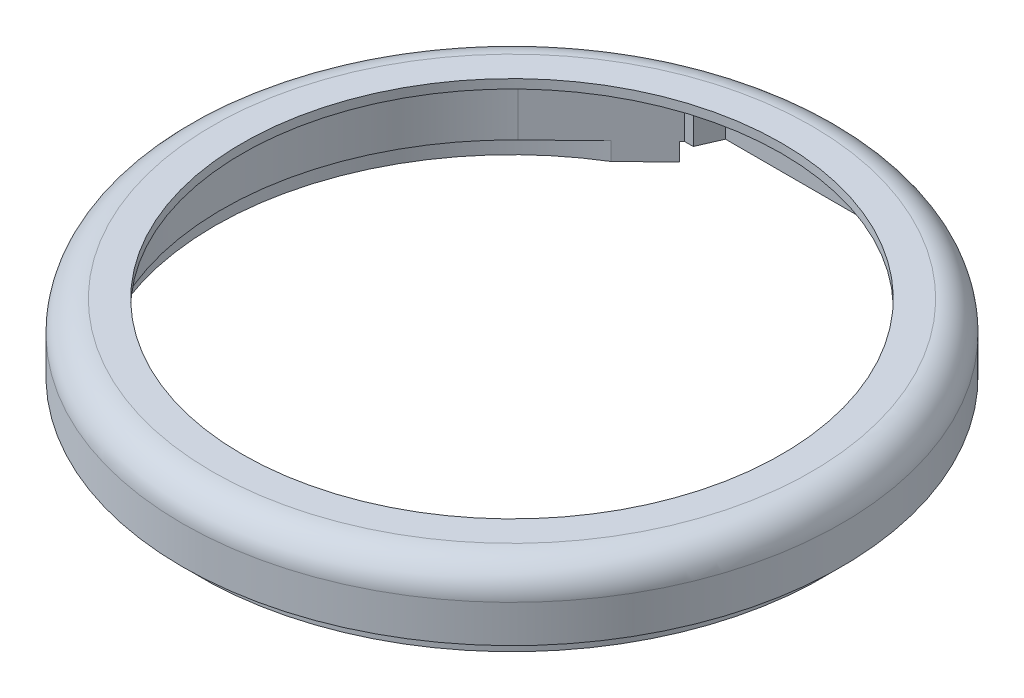
ISO-10303-21;
HEADER;
FILE_DESCRIPTION(('STEP AP214'),'2;1');
FILE_NAME('part.step','',(''),(''),'','','');
FILE_SCHEMA(('AUTOMOTIVE_DESIGN { 1 0 10303 214 1 1 1 1 }'));
ENDSEC;
DATA;
#1=APPLICATION_CONTEXT('core data for automotive mechanical design processes');
#2=APPLICATION_PROTOCOL_DEFINITION('international standard','automotive_design',2000,#1);
#3=PRODUCT_CONTEXT('',#1,'mechanical');
#4=PRODUCT('Part','Part','',(#3));
#5=PRODUCT_RELATED_PRODUCT_CATEGORY('part','',(#4));
#6=PRODUCT_DEFINITION_FORMATION('','',#4);
#7=PRODUCT_DEFINITION_CONTEXT('part definition',#1,'design');
#8=PRODUCT_DEFINITION('design','',#6,#7);
#9=PRODUCT_DEFINITION_SHAPE('','',#8);
#10=(LENGTH_UNIT() NAMED_UNIT(*) SI_UNIT(.MILLI.,.METRE.));
#11=(NAMED_UNIT(*) PLANE_ANGLE_UNIT() SI_UNIT($,.RADIAN.));
#12=(NAMED_UNIT(*) SI_UNIT($,.STERADIAN.) SOLID_ANGLE_UNIT());
#13=UNCERTAINTY_MEASURE_WITH_UNIT(LENGTH_MEASURE(1.E-05),#10,'distance_accuracy_value','');
#14=(GEOMETRIC_REPRESENTATION_CONTEXT(3) GLOBAL_UNCERTAINTY_ASSIGNED_CONTEXT((#13)) GLOBAL_UNIT_ASSIGNED_CONTEXT((#10,
#11,#12)) REPRESENTATION_CONTEXT('',''));
#15=CARTESIAN_POINT('',(0.,0.,0.));
#16=DIRECTION('',(0.,0.,1.));
#17=DIRECTION('',(1.,0.,0.));
#18=AXIS2_PLACEMENT_3D('',#15,#16,#17);
#19=CARTESIAN_POINT('',(-7.85,59.2300648638388,-19.35));
#20=DIRECTION('',(0.,0.,-1.));
#21=DIRECTION('',(-1.,0.,0.));
#22=AXIS2_PLACEMENT_3D('',#19,#20,#21);
#23=PLANE('',#22);
#24=DIRECTION('',(-1.,0.,0.));
#25=VECTOR('',#24,1.);
#26=CARTESIAN_POINT('',(0.,0.,-19.35));
#27=LINE('',#26,#25);
#28=CARTESIAN_POINT('',(-7.25,0.,-19.35));
#29=VERTEX_POINT('',#28);
#30=CARTESIAN_POINT('',(-7.85,0.,-19.35));
#31=VERTEX_POINT('',#30);
#32=EDGE_CURVE('E137',#29,#31,#27,.T.);
#33=ORIENTED_EDGE('',*,*,#32,.F.);
#34=DIRECTION('',(0.,-1.,0.));
#35=VECTOR('',#34,1.);
#36=CARTESIAN_POINT('',(-7.25,19.0773797371133,-19.35));
#37=LINE('',#36,#35);
#38=CARTESIAN_POINT('',(-7.25,3.1,-19.35));
#39=VERTEX_POINT('',#38);
#40=EDGE_CURVE('E141',#39,#29,#37,.T.);
#41=ORIENTED_EDGE('',*,*,#40,.F.);
#42=DIRECTION('',(-1.,0.,0.));
#43=VECTOR('',#42,1.);
#44=CARTESIAN_POINT('',(-7.25,3.1,-19.35));
#45=LINE('',#44,#43);
#46=CARTESIAN_POINT('',(7.25,3.1,-19.35));
#47=VERTEX_POINT('',#46);
#48=EDGE_CURVE('E162',#47,#39,#45,.T.);
#49=ORIENTED_EDGE('',*,*,#48,.F.);
#50=DIRECTION('',(0.,-1.,0.));
#51=VECTOR('',#50,1.);
#52=CARTESIAN_POINT('',(7.25,19.0773797371133,-19.35));
#53=LINE('',#52,#51);
#54=CARTESIAN_POINT('',(7.25,0.,-19.35));
#55=VERTEX_POINT('',#54);
#56=EDGE_CURVE('E165',#47,#55,#53,.T.);
#57=ORIENTED_EDGE('',*,*,#56,.T.);
#58=CARTESIAN_POINT('',(7.85,0.,-19.35));
#59=VERTEX_POINT('',#58);
#60=EDGE_CURVE('E56',#59,#55,#27,.T.);
#61=ORIENTED_EDGE('',*,*,#60,.F.);
#62=DIRECTION('',(0.,-1.,0.));
#63=VECTOR('',#62,1.);
#64=CARTESIAN_POINT('',(7.85,59.2300648638388,-19.35));
#65=LINE('',#64,#63);
#66=CARTESIAN_POINT('',(7.85,3.9,-19.35));
#67=VERTEX_POINT('',#66);
#68=EDGE_CURVE('E191',#67,#59,#65,.T.);
#69=ORIENTED_EDGE('',*,*,#68,.F.);
#70=DIRECTION('',(1.,0.,0.));
#71=VECTOR('',#70,1.);
#72=CARTESIAN_POINT('',(-7.85,3.9,-19.35));
#73=LINE('',#72,#71);
#74=CARTESIAN_POINT('',(-7.85,3.9,-19.35));
#75=VERTEX_POINT('',#74);
#76=EDGE_CURVE('E192',#75,#67,#73,.T.);
#77=ORIENTED_EDGE('',*,*,#76,.F.);
#78=DIRECTION('',(0.,-1.,0.));
#79=VECTOR('',#78,1.);
#80=CARTESIAN_POINT('',(-7.85,59.2300648638388,-19.35));
#81=LINE('',#80,#79);
#82=EDGE_CURVE('E143',#75,#31,#81,.T.);
#83=ORIENTED_EDGE('',*,*,#82,.T.);
#84=EDGE_LOOP('',(#33,#41,#49,#57,#61,#69,#77,#83));
#85=FACE_BOUND('',#84,.T.);
#86=ADVANCED_FACE('F41',(#85),#23,.F.);
#87=CARTESIAN_POINT('',(7.25,19.0773797371133,-19.35));
#88=DIRECTION('',(0.917555625309924,0.,-0.3976074376343));
#89=DIRECTION('',(-0.3976074376343,0.,-0.917555625309924));
#90=AXIS2_PLACEMENT_3D('',#87,#88,#89);
#91=PLANE('',#90);
#92=DIRECTION('',(-0.3976074376343,0.,-0.917555625309924));
#93=VECTOR('',#92,1.);
#94=CARTESIAN_POINT('',(13.1632366697848,0.,-5.70406922357343));
#95=LINE('',#94,#93);
#96=CARTESIAN_POINT('',(6.6,0.,-20.85));
#97=VERTEX_POINT('',#96);
#98=EDGE_CURVE('E155',#55,#97,#95,.T.);
#99=ORIENTED_EDGE('',*,*,#98,.F.);
#100=ORIENTED_EDGE('',*,*,#56,.F.);
#101=DIRECTION('',(0.3976074376343,0.,0.917555625309924));
#102=VECTOR('',#101,1.);
#103=CARTESIAN_POINT('',(7.25,3.1,-19.35));
#104=LINE('',#103,#102);
#105=CARTESIAN_POINT('',(7.03333333333333,3.1,-19.85));
#106=VERTEX_POINT('',#105);
#107=EDGE_CURVE('E169',#106,#47,#104,.T.);
#108=ORIENTED_EDGE('',*,*,#107,.F.);
#109=CARTESIAN_POINT('',(7.03333333333333,2.1,-19.85));
#110=DIRECTION('',(0.917555625309924,0.,-0.3976074376343));
#111=DIRECTION('',(-0.3976074376343,0.,-0.917555625309924));
#112=AXIS2_PLACEMENT_3D('',#109,#110,#111);
#113=ELLIPSE('',#112,1.08985218161812,1.);
#114=CARTESIAN_POINT('',(6.6,2.1,-20.85));
#115=VERTEX_POINT('',#114);
#116=EDGE_CURVE('E254',#106,#115,#113,.F.);
#117=ORIENTED_EDGE('',*,*,#116,.T.);
#118=DIRECTION('',(0.,-1.,0.));
#119=VECTOR('',#118,1.);
#120=CARTESIAN_POINT('',(6.6,19.0773797371133,-20.85));
#121=LINE('',#120,#119);
#122=EDGE_CURVE('E172',#115,#97,#121,.T.);
#123=ORIENTED_EDGE('',*,*,#122,.T.);
#124=EDGE_LOOP('',(#99,#100,#108,#117,#123));
#125=FACE_BOUND('',#124,.T.);
#126=ADVANCED_FACE('F257',(#125),#91,.F.);
#127=CARTESIAN_POINT('',(-7.25,19.0773797371133,-19.35));
#128=DIRECTION('',(-0.917555625309924,0.,-0.3976074376343));
#129=DIRECTION('',(-0.3976074376343,0.,0.917555625309924));
#130=AXIS2_PLACEMENT_3D('',#127,#128,#129);
#131=PLANE('',#130);
#132=ORIENTED_EDGE('',*,*,#40,.T.);
#133=DIRECTION('',(-0.3976074376343,0.,0.917555625309924));
#134=VECTOR('',#133,1.);
#135=CARTESIAN_POINT('',(-13.1632366697848,0.,-5.70406922357343));
#136=LINE('',#135,#134);
#137=CARTESIAN_POINT('',(-6.6,0.,-20.85));
#138=VERTEX_POINT('',#137);
#139=EDGE_CURVE('E149',#138,#29,#136,.T.);
#140=ORIENTED_EDGE('',*,*,#139,.F.);
#141=DIRECTION('',(0.,-1.,0.));
#142=VECTOR('',#141,1.);
#143=CARTESIAN_POINT('',(-6.6,19.0773797371133,-20.85));
#144=LINE('',#143,#142);
#145=CARTESIAN_POINT('',(-6.6,2.1,-20.85));
#146=VERTEX_POINT('',#145);
#147=EDGE_CURVE('E156',#146,#138,#144,.T.);
#148=ORIENTED_EDGE('',*,*,#147,.F.);
#149=CARTESIAN_POINT('',(-7.03333333333333,2.1,-19.85));
#150=DIRECTION('',(-0.917555625309924,0.,-0.3976074376343));
#151=DIRECTION('',(-0.3976074376343,0.,0.917555625309924));
#152=AXIS2_PLACEMENT_3D('',#149,#150,#151);
#153=ELLIPSE('',#152,1.08985218161812,1.);
#154=CARTESIAN_POINT('',(-7.03333333333333,3.1,-19.85));
#155=VERTEX_POINT('',#154);
#156=EDGE_CURVE('E12',#146,#155,#153,.F.);
#157=ORIENTED_EDGE('',*,*,#156,.T.);
#158=DIRECTION('',(0.3976074376343,0.,-0.917555625309924));
#159=VECTOR('',#158,1.);
#160=CARTESIAN_POINT('',(-7.25,3.1,-19.35));
#161=LINE('',#160,#159);
#162=EDGE_CURVE('E161',#39,#155,#161,.T.);
#163=ORIENTED_EDGE('',*,*,#162,.F.);
#164=EDGE_LOOP('',(#132,#140,#148,#157,#163));
#165=FACE_BOUND('',#164,.T.);
#166=ADVANCED_FACE('F159',(#165),#131,.F.);
#167=CARTESIAN_POINT('',(0.,-1.2,0.));
#168=DIRECTION('',(0.,-1.,0.));
#169=DIRECTION('',(0.,0.,-1.));
#170=AXIS2_PLACEMENT_3D('',#167,#168,#169);
#171=PLANE('',#170);
#172=DIRECTION('',(0.717357153504799,0.,-0.696705615246133));
#173=VECTOR('',#172,1.);
#174=CARTESIAN_POINT('',(-13.4812536550127,-1.2,-13.8808609203179));
#175=LINE('',#174,#173);
#176=CARTESIAN_POINT('',(-10.337698351041,-1.2,-16.9339184125495));
#177=VERTEX_POINT('',#176);
#178=CARTESIAN_POINT('',(-8.00779036845107,-1.2,-19.1967521579808));
#179=VERTEX_POINT('',#178);
#180=EDGE_CURVE('E176',#177,#179,#175,.T.);
#181=ORIENTED_EDGE('',*,*,#180,.F.);
#182=CARTESIAN_POINT('',(0.,-1.2,0.));
#183=DIRECTION('',(0.,-1.,0.));
#184=DIRECTION('',(0.,0.,-1.));
#185=AXIS2_PLACEMENT_3D('',#182,#183,#184);
#186=CIRCLE('',#185,19.84);
#187=CARTESIAN_POINT('',(10.337698351041,-1.2,-16.9339184125495));
#188=VERTEX_POINT('',#187);
#189=EDGE_CURVE('E219',#188,#177,#186,.T.);
#190=ORIENTED_EDGE('',*,*,#189,.F.);
#191=DIRECTION('',(0.717357153504799,0.,0.696705615246133));
#192=VECTOR('',#191,1.);
#193=CARTESIAN_POINT('',(7.85,-1.2,-19.35));
#194=LINE('',#193,#192);
#195=CARTESIAN_POINT('',(8.00779036845107,-1.2,-19.1967521579808));
#196=VERTEX_POINT('',#195);
#197=EDGE_CURVE('E178',#196,#188,#194,.T.);
#198=ORIENTED_EDGE('',*,*,#197,.F.);
#199=CARTESIAN_POINT('',(0.,-1.2,0.));
#200=DIRECTION('',(0.,-1.,0.));
#201=DIRECTION('',(0.,0.,-1.));
#202=AXIS2_PLACEMENT_3D('',#199,#200,#201);
#203=CIRCLE('',#202,20.8);
#204=EDGE_CURVE('E222',#196,#179,#203,.T.);
#205=ORIENTED_EDGE('',*,*,#204,.T.);
#206=EDGE_LOOP('',(#181,#190,#198,#205));
#207=FACE_BOUND('',#206,.T.);
#208=ADVANCED_FACE('F278',(#207),#171,.T.);
#209=CARTESIAN_POINT('',(0.,-1.2,0.));
#210=DIRECTION('',(0.,1.,0.));
#211=DIRECTION('',(0.,0.,1.));
#212=AXIS2_PLACEMENT_3D('',#209,#210,#211);
#213=CYLINDRICAL_SURFACE('',#212,20.8);
#214=CARTESIAN_POINT('',(0.,0.,0.));
#215=DIRECTION('',(0.,1.,0.));
#216=DIRECTION('',(0.,0.,1.));
#217=AXIS2_PLACEMENT_3D('',#214,#215,#216);
#218=CIRCLE('',#217,20.8);
#219=CARTESIAN_POINT('',(8.00779036845107,0.,-19.1967521579808));
#220=VERTEX_POINT('',#219);
#221=CARTESIAN_POINT('',(-8.00779036845107,0.,-19.1967521579808));
#222=VERTEX_POINT('',#221);
#223=EDGE_CURVE('E230',#220,#222,#218,.F.);
#224=ORIENTED_EDGE('',*,*,#223,.T.);
#225=DIRECTION('',(0.,1.,0.));
#226=VECTOR('',#225,1.);
#227=CARTESIAN_POINT('',(-8.00779036845107,-1.2,-19.1967521579808));
#228=LINE('',#227,#226);
#229=EDGE_CURVE('E210',#222,#179,#228,.F.);
#230=ORIENTED_EDGE('',*,*,#229,.T.);
#231=ORIENTED_EDGE('',*,*,#204,.F.);
#232=DIRECTION('',(0.,1.,0.));
#233=VECTOR('',#232,1.);
#234=CARTESIAN_POINT('',(8.00779036845107,-1.2,-19.1967521579808));
#235=LINE('',#234,#233);
#236=EDGE_CURVE('E204',#196,#220,#235,.T.);
#237=ORIENTED_EDGE('',*,*,#236,.T.);
#238=EDGE_LOOP('',(#224,#230,#231,#237));
#239=FACE_BOUND('',#238,.T.);
#240=ADVANCED_FACE('F271',(#239),#213,.T.);
#241=CARTESIAN_POINT('',(0.,-1.2,0.));
#242=DIRECTION('',(0.,1.,0.));
#243=DIRECTION('',(0.,0.,1.));
#244=AXIS2_PLACEMENT_3D('',#241,#242,#243);
#245=CYLINDRICAL_SURFACE('',#244,19.84);
#246=DIRECTION('',(0.,1.,0.));
#247=VECTOR('',#246,1.);
#248=CARTESIAN_POINT('',(-10.337698351041,-1.2,-16.9339184125495));
#249=LINE('',#248,#247);
#250=CARTESIAN_POINT('',(-10.337698351041,0.,-16.9339184125495));
#251=VERTEX_POINT('',#250);
#252=EDGE_CURVE('E145',#251,#177,#249,.F.);
#253=ORIENTED_EDGE('',*,*,#252,.F.);
#254=CARTESIAN_POINT('',(0.,0.,0.));
#255=DIRECTION('',(0.,-1.,0.));
#256=DIRECTION('',(0.,0.,-1.));
#257=AXIS2_PLACEMENT_3D('',#254,#255,#256);
#258=CIRCLE('',#257,19.84);
#259=CARTESIAN_POINT('',(10.337698351041,0.,-16.9339184125495));
#260=VERTEX_POINT('',#259);
#261=EDGE_CURVE('E218',#260,#251,#258,.T.);
#262=ORIENTED_EDGE('',*,*,#261,.F.);
#263=DIRECTION('',(0.,1.,0.));
#264=VECTOR('',#263,1.);
#265=CARTESIAN_POINT('',(10.337698351041,-1.2,-16.9339184125495));
#266=LINE('',#265,#264);
#267=EDGE_CURVE('E202',#188,#260,#266,.T.);
#268=ORIENTED_EDGE('',*,*,#267,.F.);
#269=ORIENTED_EDGE('',*,*,#189,.T.);
#270=EDGE_LOOP('',(#253,#262,#268,#269));
#271=FACE_BOUND('',#270,.T.);
#272=ADVANCED_FACE('F281',(#271),#245,.F.);
#273=CARTESIAN_POINT('',(0.,4.5,0.));
#274=DIRECTION('',(0.,-1.,0.));
#275=DIRECTION('',(0.,0.,-1.));
#276=AXIS2_PLACEMENT_3D('',#273,#274,#275);
#277=CYLINDRICAL_SURFACE('',#276,22.);
#278=CARTESIAN_POINT('',(0.,2.5,0.));
#279=DIRECTION('',(0.,1.,0.));
#280=DIRECTION('',(0.,0.,1.));
#281=AXIS2_PLACEMENT_3D('',#278,#279,#280);
#282=CIRCLE('',#281,22.);
#283=CARTESIAN_POINT('',(0.,2.5,22.));
#284=VERTEX_POINT('',#283);
#285=EDGE_CURVE('E248',#284,#284,#282,.F.);
#286=ORIENTED_EDGE('',*,*,#285,.T.);
#287=EDGE_LOOP('',(#286));
#288=FACE_BOUND('',#287,.T.);
#289=CARTESIAN_POINT('',(0.,0.,0.));
#290=DIRECTION('',(0.,1.,0.));
#291=DIRECTION('',(0.,0.,1.));
#292=AXIS2_PLACEMENT_3D('',#289,#290,#291);
#293=CIRCLE('',#292,22.);
#294=CARTESIAN_POINT('',(0.,0.,22.));
#295=VERTEX_POINT('',#294);
#296=EDGE_CURVE('E227',#295,#295,#293,.T.);
#297=ORIENTED_EDGE('',*,*,#296,.T.);
#298=EDGE_LOOP('',(#297));
#299=FACE_BOUND('',#298,.T.);
#300=ADVANCED_FACE('F306',(#288,#299),#277,.T.);
#301=CARTESIAN_POINT('',(0.,4.5,0.));
#302=DIRECTION('',(0.,1.,0.));
#303=DIRECTION('',(0.,0.,1.));
#304=AXIS2_PLACEMENT_3D('',#301,#302,#303);
#305=PLANE('',#304);
#306=CARTESIAN_POINT('',(0.,4.5,0.));
#307=DIRECTION('',(0.,1.,0.));
#308=DIRECTION('',(0.,0.,1.));
#309=AXIS2_PLACEMENT_3D('',#306,#307,#308);
#310=CIRCLE('',#309,20.);
#311=CARTESIAN_POINT('',(0.,4.5,20.));
#312=VERTEX_POINT('',#311);
#313=EDGE_CURVE('E245',#312,#312,#310,.T.);
#314=ORIENTED_EDGE('',*,*,#313,.T.);
#315=EDGE_LOOP('',(#314));
#316=FACE_BOUND('',#315,.T.);
#317=CARTESIAN_POINT('',(0.,4.5,0.));
#318=DIRECTION('',(0.,1.,0.));
#319=DIRECTION('',(0.,0.,1.));
#320=AXIS2_PLACEMENT_3D('',#317,#318,#319);
#321=CIRCLE('',#320,18.);
#322=CARTESIAN_POINT('',(0.,4.5,18.));
#323=VERTEX_POINT('',#322);
#324=EDGE_CURVE('E215',#323,#323,#321,.T.);
#325=ORIENTED_EDGE('',*,*,#324,.F.);
#326=EDGE_LOOP('',(#325));
#327=FACE_BOUND('',#326,.T.);
#328=ADVANCED_FACE('F304',(#316,#327),#305,.T.);
#329=CARTESIAN_POINT('',(0.,0.,0.));
#330=DIRECTION('',(0.,1.,0.));
#331=DIRECTION('',(0.,0.,1.));
#332=AXIS2_PLACEMENT_3D('',#329,#330,#331);
#333=PLANE('',#332);
#334=ORIENTED_EDGE('',*,*,#60,.T.);
#335=ORIENTED_EDGE('',*,*,#98,.T.);
#336=DIRECTION('',(-1.,0.,0.));
#337=VECTOR('',#336,1.);
#338=CARTESIAN_POINT('',(0.,0.,-20.85));
#339=LINE('',#338,#337);
#340=EDGE_CURVE('E153',#97,#138,#339,.T.);
#341=ORIENTED_EDGE('',*,*,#340,.T.);
#342=ORIENTED_EDGE('',*,*,#139,.T.);
#343=ORIENTED_EDGE('',*,*,#32,.T.);
#344=DIRECTION('',(-0.717357153504799,0.,0.696705615246133));
#345=VECTOR('',#344,1.);
#346=CARTESIAN_POINT('',(-13.4812536550127,0.,-13.8808609203179));
#347=LINE('',#346,#345);
#348=EDGE_CURVE('E213',#31,#222,#347,.T.);
#349=ORIENTED_EDGE('',*,*,#348,.T.);
#350=ORIENTED_EDGE('',*,*,#223,.F.);
#351=DIRECTION('',(-0.717357153504799,0.,-0.696705615246133));
#352=VECTOR('',#351,1.);
#353=CARTESIAN_POINT('',(13.4812536550127,0.,-13.8808609203179));
#354=LINE('',#353,#352);
#355=EDGE_CURVE('E207',#220,#59,#354,.T.);
#356=ORIENTED_EDGE('',*,*,#355,.T.);
#357=EDGE_LOOP('',(#334,#335,#341,#342,#343,#349,#350,#356));
#358=FACE_BOUND('',#357,.T.);
#359=ORIENTED_EDGE('',*,*,#296,.F.);
#360=EDGE_LOOP('',(#359));
#361=FACE_BOUND('',#360,.T.);
#362=ADVANCED_FACE('F150',(#358,#361),#333,.F.);
#363=ORIENTED_EDGE('',*,*,#261,.T.);
#364=DIRECTION('',(-0.717357153504799,0.,0.696705615246133));
#365=VECTOR('',#364,1.);
#366=CARTESIAN_POINT('',(-13.4812536550127,0.,-13.8808609203179));
#367=LINE('',#366,#365);
#368=CARTESIAN_POINT('',(-13.4812536550127,0.,-13.8808609203179));
#369=VERTEX_POINT('',#368);
#370=EDGE_CURVE('E241',#251,#369,#367,.T.);
#371=ORIENTED_EDGE('',*,*,#370,.T.);
#372=CARTESIAN_POINT('',(0.,0.,0.));
#373=DIRECTION('',(0.,1.,0.));
#374=DIRECTION('',(0.,0.,1.));
#375=AXIS2_PLACEMENT_3D('',#372,#373,#374);
#376=CIRCLE('',#375,19.35);
#377=CARTESIAN_POINT('',(13.4812536550127,0.,-13.8808609203179));
#378=VERTEX_POINT('',#377);
#379=EDGE_CURVE('E233',#369,#378,#376,.T.);
#380=ORIENTED_EDGE('',*,*,#379,.T.);
#381=DIRECTION('',(-0.717357153504799,0.,-0.696705615246133));
#382=VECTOR('',#381,1.);
#383=CARTESIAN_POINT('',(13.4812536550127,0.,-13.8808609203179));
#384=LINE('',#383,#382);
#385=EDGE_CURVE('E238',#378,#260,#384,.T.);
#386=ORIENTED_EDGE('',*,*,#385,.T.);
#387=EDGE_LOOP('',(#363,#371,#380,#386));
#388=FACE_BOUND('',#387,.T.);
#389=ADVANCED_FACE('F285',(#388),#333,.F.);
#390=CARTESIAN_POINT('',(0.,-1.2,0.));
#391=DIRECTION('',(0.,1.,0.));
#392=DIRECTION('',(0.,0.,1.));
#393=AXIS2_PLACEMENT_3D('',#390,#391,#392);
#394=CYLINDRICAL_SURFACE('',#393,18.);
#395=CARTESIAN_POINT('',(0.,3.9,0.));
#396=DIRECTION('',(0.,1.,0.));
#397=DIRECTION('',(0.,0.,1.));
#398=AXIS2_PLACEMENT_3D('',#395,#396,#397);
#399=CIRCLE('',#398,18.);
#400=CARTESIAN_POINT('',(0.,3.9,18.));
#401=VERTEX_POINT('',#400);
#402=EDGE_CURVE('E201',#401,#401,#399,.F.);
#403=ORIENTED_EDGE('',*,*,#402,.T.);
#404=EDGE_LOOP('',(#403));
#405=FACE_BOUND('',#404,.T.);
#406=ORIENTED_EDGE('',*,*,#324,.T.);
#407=EDGE_LOOP('',(#406));
#408=FACE_BOUND('',#407,.T.);
#409=ADVANCED_FACE('F298',(#405,#408),#394,.F.);
#410=CARTESIAN_POINT('',(-13.4812536550127,59.2300648638388,-13.8808609203179));
#411=DIRECTION('',(-0.696705615246133,0.,-0.717357153504799));
#412=DIRECTION('',(-0.717357153504799,0.,0.696705615246133));
#413=AXIS2_PLACEMENT_3D('',#410,#411,#412);
#414=PLANE('',#413);
#415=ORIENTED_EDGE('',*,*,#82,.F.);
#416=DIRECTION('',(0.717357153504799,0.,-0.696705615246133));
#417=VECTOR('',#416,1.);
#418=CARTESIAN_POINT('',(-13.4812536550127,3.9,-13.8808609203179));
#419=LINE('',#418,#417);
#420=CARTESIAN_POINT('',(-13.4812536550127,3.9,-13.8808609203179));
#421=VERTEX_POINT('',#420);
#422=EDGE_CURVE('E180',#421,#75,#419,.T.);
#423=ORIENTED_EDGE('',*,*,#422,.F.);
#424=DIRECTION('',(0.,-1.,0.));
#425=VECTOR('',#424,1.);
#426=CARTESIAN_POINT('',(-13.4812536550127,59.2300648638388,-13.8808609203179));
#427=LINE('',#426,#425);
#428=EDGE_CURVE('E186',#421,#369,#427,.T.);
#429=ORIENTED_EDGE('',*,*,#428,.T.);
#430=ORIENTED_EDGE('',*,*,#370,.F.);
#431=ORIENTED_EDGE('',*,*,#252,.T.);
#432=ORIENTED_EDGE('',*,*,#180,.T.);
#433=ORIENTED_EDGE('',*,*,#229,.F.);
#434=ORIENTED_EDGE('',*,*,#348,.F.);
#435=EDGE_LOOP('',(#415,#423,#429,#430,#431,#432,#433,#434));
#436=FACE_BOUND('',#435,.T.);
#437=ADVANCED_FACE('F290',(#436),#414,.F.);
#438=CARTESIAN_POINT('',(7.85,59.2300648638388,-19.35));
#439=DIRECTION('',(0.696705615246133,0.,-0.717357153504799));
#440=DIRECTION('',(-0.717357153504799,0.,-0.696705615246133));
#441=AXIS2_PLACEMENT_3D('',#438,#439,#440);
#442=PLANE('',#441);
#443=ORIENTED_EDGE('',*,*,#236,.F.);
#444=ORIENTED_EDGE('',*,*,#197,.T.);
#445=ORIENTED_EDGE('',*,*,#267,.T.);
#446=ORIENTED_EDGE('',*,*,#385,.F.);
#447=DIRECTION('',(0.,-1.,0.));
#448=VECTOR('',#447,1.);
#449=CARTESIAN_POINT('',(13.4812536550127,59.2300648638388,-13.8808609203179));
#450=LINE('',#449,#448);
#451=CARTESIAN_POINT('',(13.4812536550127,3.9,-13.8808609203179));
#452=VERTEX_POINT('',#451);
#453=EDGE_CURVE('E187',#452,#378,#450,.T.);
#454=ORIENTED_EDGE('',*,*,#453,.F.);
#455=DIRECTION('',(0.717357153504799,0.,0.696705615246133));
#456=VECTOR('',#455,1.);
#457=CARTESIAN_POINT('',(7.85,3.9,-19.35));
#458=LINE('',#457,#456);
#459=EDGE_CURVE('E188',#67,#452,#458,.T.);
#460=ORIENTED_EDGE('',*,*,#459,.F.);
#461=ORIENTED_EDGE('',*,*,#68,.T.);
#462=ORIENTED_EDGE('',*,*,#355,.F.);
#463=EDGE_LOOP('',(#443,#444,#445,#446,#454,#460,#461,#462));
#464=FACE_BOUND('',#463,.T.);
#465=ADVANCED_FACE('F267',(#464),#442,.F.);
#466=CARTESIAN_POINT('',(0.,59.2300648638388,0.));
#467=DIRECTION('',(0.,-1.,0.));
#468=DIRECTION('',(0.,0.,-1.));
#469=AXIS2_PLACEMENT_3D('',#466,#467,#468);
#470=CYLINDRICAL_SURFACE('',#469,19.35);
#471=ORIENTED_EDGE('',*,*,#428,.F.);
#472=CARTESIAN_POINT('',(0.,3.9,0.));
#473=DIRECTION('',(0.,1.,0.));
#474=DIRECTION('',(0.,0.,1.));
#475=AXIS2_PLACEMENT_3D('',#472,#473,#474);
#476=CIRCLE('',#475,19.35);
#477=EDGE_CURVE('E183',#452,#421,#476,.F.);
#478=ORIENTED_EDGE('',*,*,#477,.F.);
#479=ORIENTED_EDGE('',*,*,#453,.T.);
#480=ORIENTED_EDGE('',*,*,#379,.F.);
#481=EDGE_LOOP('',(#471,#478,#479,#480));
#482=FACE_BOUND('',#481,.T.);
#483=ADVANCED_FACE('F288',(#482),#470,.F.);
#484=CARTESIAN_POINT('',(0.,3.9,0.));
#485=DIRECTION('',(0.,1.,0.));
#486=DIRECTION('',(0.,0.,1.));
#487=AXIS2_PLACEMENT_3D('',#484,#485,#486);
#488=PLANE('',#487);
#489=ORIENTED_EDGE('',*,*,#477,.T.);
#490=ORIENTED_EDGE('',*,*,#422,.T.);
#491=ORIENTED_EDGE('',*,*,#76,.T.);
#492=ORIENTED_EDGE('',*,*,#459,.T.);
#493=EDGE_LOOP('',(#489,#490,#491,#492));
#494=FACE_BOUND('',#493,.T.);
#495=ORIENTED_EDGE('',*,*,#402,.F.);
#496=EDGE_LOOP('',(#495));
#497=FACE_BOUND('',#496,.T.);
#498=ADVANCED_FACE('F292',(#494,#497),#488,.F.);
#499=CARTESIAN_POINT('',(-6.6,19.0773797371133,-20.85));
#500=DIRECTION('',(0.,0.,-1.));
#501=DIRECTION('',(-1.,0.,0.));
#502=AXIS2_PLACEMENT_3D('',#499,#500,#501);
#503=PLANE('',#502);
#504=ORIENTED_EDGE('',*,*,#122,.F.);
#505=DIRECTION('',(1.,0.,0.));
#506=VECTOR('',#505,1.);
#507=CARTESIAN_POINT('',(-6.6,2.1,-20.85));
#508=LINE('',#507,#506);
#509=EDGE_CURVE('E49',#115,#146,#508,.F.);
#510=ORIENTED_EDGE('',*,*,#509,.T.);
#511=ORIENTED_EDGE('',*,*,#147,.T.);
#512=ORIENTED_EDGE('',*,*,#340,.F.);
#513=EDGE_LOOP('',(#504,#510,#511,#512));
#514=FACE_BOUND('',#513,.T.);
#515=ADVANCED_FACE('F261',(#514),#503,.F.);
#516=CARTESIAN_POINT('',(0.,3.1,0.));
#517=DIRECTION('',(0.,1.,0.));
#518=DIRECTION('',(0.,0.,1.));
#519=AXIS2_PLACEMENT_3D('',#516,#517,#518);
#520=PLANE('',#519);
#521=ORIENTED_EDGE('',*,*,#162,.T.);
#522=DIRECTION('',(1.,0.,0.));
#523=VECTOR('',#522,1.);
#524=CARTESIAN_POINT('',(6.6,3.1,-19.85));
#525=LINE('',#524,#523);
#526=EDGE_CURVE('E251',#155,#106,#525,.T.);
#527=ORIENTED_EDGE('',*,*,#526,.T.);
#528=ORIENTED_EDGE('',*,*,#107,.T.);
#529=ORIENTED_EDGE('',*,*,#48,.T.);
#530=EDGE_LOOP('',(#521,#527,#528,#529));
#531=FACE_BOUND('',#530,.T.);
#532=ADVANCED_FACE('F264',(#531),#520,.F.);
#533=CARTESIAN_POINT('',(0.,2.5,0.));
#534=DIRECTION('',(0.,1.,0.));
#535=DIRECTION('',(0.,0.,1.));
#536=AXIS2_PLACEMENT_3D('',#533,#534,#535);
#537=TOROIDAL_SURFACE('',#536,20.,2.);
#538=ORIENTED_EDGE('',*,*,#285,.F.);
#539=EDGE_LOOP('',(#538));
#540=FACE_BOUND('',#539,.T.);
#541=ORIENTED_EDGE('',*,*,#313,.F.);
#542=EDGE_LOOP('',(#541));
#543=FACE_BOUND('',#542,.T.);
#544=ADVANCED_FACE('F420',(#540,#543),#537,.T.);
#545=CARTESIAN_POINT('',(0.,2.1,-19.85));
#546=DIRECTION('',(-1.,0.,0.));
#547=DIRECTION('',(0.,0.,1.));
#548=AXIS2_PLACEMENT_3D('',#545,#546,#547);
#549=CYLINDRICAL_SURFACE('',#548,1.);
#550=ORIENTED_EDGE('',*,*,#156,.F.);
#551=ORIENTED_EDGE('',*,*,#509,.F.);
#552=ORIENTED_EDGE('',*,*,#116,.F.);
#553=ORIENTED_EDGE('',*,*,#526,.F.);
#554=EDGE_LOOP('',(#550,#551,#552,#553));
#555=FACE_BOUND('',#554,.T.);
#556=ADVANCED_FACE('F43',(#555),#549,.F.);
#557=CLOSED_SHELL('',(#86,#126,#166,#208,#240,#272,#300,#328,#362,#389,#409,#437,#465,#483,#498,
#515,#532,#544,#556));
#558=MANIFOLD_SOLID_BREP('B2',#557);
#559=ADVANCED_BREP_SHAPE_REPRESENTATION('',(#18,#558),#14);
#560=SHAPE_DEFINITION_REPRESENTATION(#9,#559);
ENDSEC;
END-ISO-10303-21;
